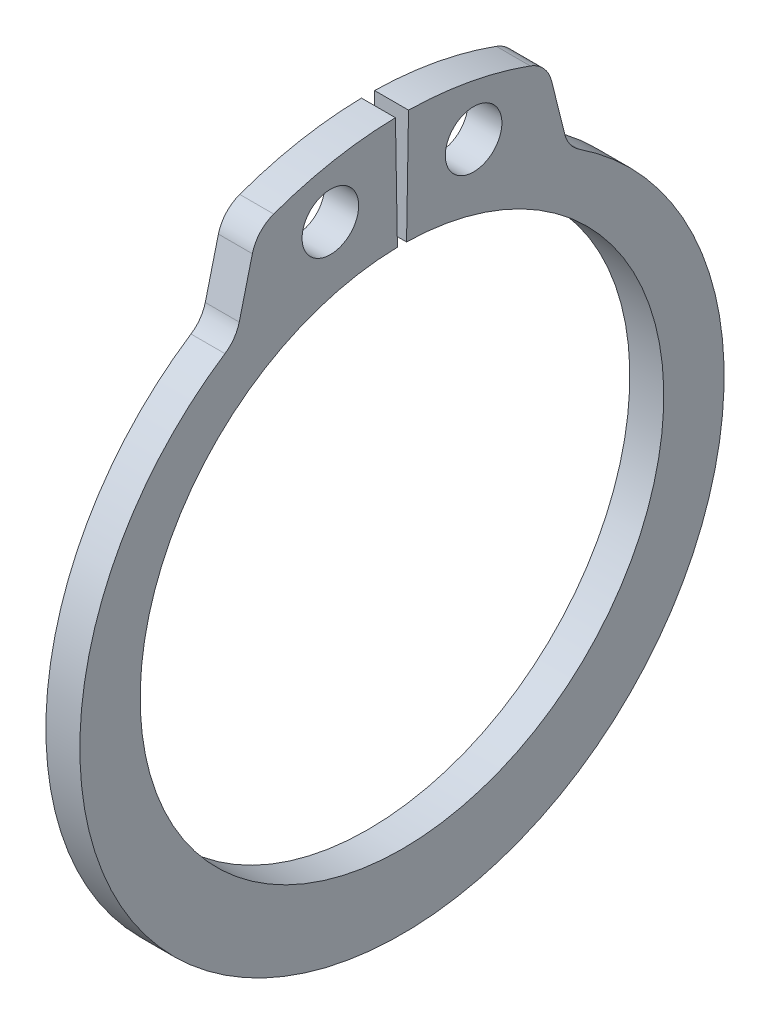
ISO-10303-21;
HEADER;
FILE_DESCRIPTION(('STEP AP214'),'2;1');
FILE_NAME('part.step','',(''),(''),'','','');
FILE_SCHEMA(('AUTOMOTIVE_DESIGN { 1 0 10303 214 1 1 1 1 }'));
ENDSEC;
DATA;
#1=APPLICATION_CONTEXT('core data for automotive mechanical design processes');
#2=APPLICATION_PROTOCOL_DEFINITION('international standard','automotive_design',2000,#1);
#3=PRODUCT_CONTEXT('',#1,'mechanical');
#4=PRODUCT('Part','Part','',(#3));
#5=PRODUCT_RELATED_PRODUCT_CATEGORY('part','',(#4));
#6=PRODUCT_DEFINITION_FORMATION('','',#4);
#7=PRODUCT_DEFINITION_CONTEXT('part definition',#1,'design');
#8=PRODUCT_DEFINITION('design','',#6,#7);
#9=PRODUCT_DEFINITION_SHAPE('','',#8);
#10=(LENGTH_UNIT() NAMED_UNIT(*) SI_UNIT(.MILLI.,.METRE.));
#11=(NAMED_UNIT(*) PLANE_ANGLE_UNIT() SI_UNIT($,.RADIAN.));
#12=(NAMED_UNIT(*) SI_UNIT($,.STERADIAN.) SOLID_ANGLE_UNIT());
#13=UNCERTAINTY_MEASURE_WITH_UNIT(LENGTH_MEASURE(1.E-05),#10,'distance_accuracy_value','');
#14=(GEOMETRIC_REPRESENTATION_CONTEXT(3) GLOBAL_UNCERTAINTY_ASSIGNED_CONTEXT((#13)) GLOBAL_UNIT_ASSIGNED_CONTEXT((#10,
#11,#12)) REPRESENTATION_CONTEXT('',''));
#15=CARTESIAN_POINT('',(0.,0.,0.));
#16=DIRECTION('',(0.,0.,1.));
#17=DIRECTION('',(1.,0.,0.));
#18=AXIS2_PLACEMENT_3D('',#15,#16,#17);
#19=CARTESIAN_POINT('',(0.6,0.,0.));
#20=DIRECTION('',(1.,0.,0.));
#21=DIRECTION('',(0.,0.,-1.));
#22=AXIS2_PLACEMENT_3D('',#19,#20,#21);
#23=PLANE('',#22);
#24=CARTESIAN_POINT('',(0.6,11.2075498339008,2.53014564968776));
#25=DIRECTION('',(1.,0.,0.));
#26=DIRECTION('',(0.,0.,-1.));
#27=AXIS2_PLACEMENT_3D('',#24,#25,#26);
#28=CIRCLE('',#27,1.);
#29=CARTESIAN_POINT('',(0.6,11.2075498339008,1.53014564968776));
#30=VERTEX_POINT('',#29);
#31=EDGE_CURVE('E218',#30,#30,#28,.T.);
#32=ORIENTED_EDGE('',*,*,#31,.F.);
#33=EDGE_LOOP('',(#32));
#34=FACE_BOUND('',#33,.T.);
#35=CARTESIAN_POINT('',(0.6,0.,0.));
#36=DIRECTION('',(1.,0.,0.));
#37=DIRECTION('',(0.,0.,-1.));
#38=AXIS2_PLACEMENT_3D('',#35,#36,#37);
#39=CIRCLE('',#38,13.25);
#40=CARTESIAN_POINT('',(0.6,13.2479819608222,0.231244385294007));
#41=VERTEX_POINT('',#40);
#42=CARTESIAN_POINT('',(0.6,12.4507767148435,4.53218040209241));
#43=VERTEX_POINT('',#42);
#44=EDGE_CURVE('E135',#41,#43,#39,.T.);
#45=ORIENTED_EDGE('',*,*,#44,.T.);
#46=CARTESIAN_POINT('',(0.6,11.3231592010464,4.12171878077083));
#47=DIRECTION('',(1.,0.,0.));
#48=DIRECTION('',(0.,0.,-1.));
#49=AXIS2_PLACEMENT_3D('',#46,#47,#48);
#50=CIRCLE('',#49,1.2);
#51=CARTESIAN_POINT('',(0.6,11.613465475766,5.28607365230203));
#52=VERTEX_POINT('',#51);
#53=EDGE_CURVE('E172',#43,#52,#50,.T.);
#54=ORIENTED_EDGE('',*,*,#53,.T.);
#55=DIRECTION('',(0.,-0.970295726275997,0.241921895599665));
#56=VECTOR('',#55,1.);
#57=CARTESIAN_POINT('',(0.6,12.2139395720065,5.13635864512732));
#58=LINE('',#57,#56);
#59=CARTESIAN_POINT('',(0.6,9.75327839740805,5.74987038146369));
#60=VERTEX_POINT('',#59);
#61=EDGE_CURVE('E210',#52,#60,#58,.T.);
#62=ORIENTED_EDGE('',*,*,#61,.T.);
#63=CARTESIAN_POINT('',(0.6,10.0435846721276,6.91422525299489));
#64=DIRECTION('',(1.,0.,0.));
#65=DIRECTION('',(0.,0.,-1.));
#66=AXIS2_PLACEMENT_3D('',#63,#64,#65);
#67=CIRCLE('',#66,1.2);
#68=CARTESIAN_POINT('',(0.6,9.04102340024933,6.25477783573576));
#69=VERTEX_POINT('',#68);
#70=EDGE_CURVE('E183',#60,#69,#67,.F.);
#71=ORIENTED_EDGE('',*,*,#70,.T.);
#72=CARTESIAN_POINT('',(0.6,-0.468147245038732,0.));
#73=DIRECTION('',(1.,0.,0.));
#74=DIRECTION('',(0.,0.,-1.));
#75=AXIS2_PLACEMENT_3D('',#72,#73,#74);
#76=CIRCLE('',#75,11.3818527549613);
#77=CARTESIAN_POINT('',(0.6,9.04102340024933,-6.25477783573577));
#78=VERTEX_POINT('',#77);
#79=EDGE_CURVE('E205',#69,#78,#76,.T.);
#80=ORIENTED_EDGE('',*,*,#79,.T.);
#81=CARTESIAN_POINT('',(0.6,10.0435846721276,-6.9142252529949));
#82=DIRECTION('',(1.,0.,0.));
#83=DIRECTION('',(0.,0.,-1.));
#84=AXIS2_PLACEMENT_3D('',#81,#82,#83);
#85=CIRCLE('',#84,1.2);
#86=CARTESIAN_POINT('',(0.6,9.75327839740804,-5.7498703814637));
#87=VERTEX_POINT('',#86);
#88=EDGE_CURVE('E11',#78,#87,#85,.F.);
#89=ORIENTED_EDGE('',*,*,#88,.T.);
#90=DIRECTION('',(0.,0.970295726275997,0.241921895599666));
#91=VECTOR('',#90,1.);
#92=CARTESIAN_POINT('',(0.6,12.2139395720065,-5.13635864512732));
#93=LINE('',#92,#91);
#94=CARTESIAN_POINT('',(0.6,11.613465475766,-5.28607365230203));
#95=VERTEX_POINT('',#94);
#96=EDGE_CURVE('E204',#87,#95,#93,.T.);
#97=ORIENTED_EDGE('',*,*,#96,.T.);
#98=CARTESIAN_POINT('',(0.6,11.3231592010464,-4.12171878077084));
#99=DIRECTION('',(1.,0.,0.));
#100=DIRECTION('',(0.,0.,-1.));
#101=AXIS2_PLACEMENT_3D('',#98,#99,#100);
#102=CIRCLE('',#101,1.2);
#103=CARTESIAN_POINT('',(0.6,12.4507767148435,-4.53218040209241));
#104=VERTEX_POINT('',#103);
#105=EDGE_CURVE('E50',#95,#104,#102,.T.);
#106=ORIENTED_EDGE('',*,*,#105,.T.);
#107=CARTESIAN_POINT('',(0.6,0.,0.));
#108=DIRECTION('',(1.,0.,0.));
#109=DIRECTION('',(0.,0.,1.));
#110=AXIS2_PLACEMENT_3D('',#107,#108,#109);
#111=CIRCLE('',#110,13.25);
#112=CARTESIAN_POINT('',(0.6,13.2479819608222,-0.231244385294012));
#113=VERTEX_POINT('',#112);
#114=EDGE_CURVE('E207',#104,#113,#111,.T.);
#115=ORIENTED_EDGE('',*,*,#114,.T.);
#116=DIRECTION('',(0.,-0.999847695156391,0.0174524064372846));
#117=VECTOR('',#116,1.);
#118=CARTESIAN_POINT('',(0.6,13.2479819608222,-0.231244385294011));
#119=LINE('',#118,#117);
#120=CARTESIAN_POINT('',(0.6,9.24859118019662,-0.161434759544873));
#121=VERTEX_POINT('',#120);
#122=EDGE_CURVE('E141',#113,#121,#119,.T.);
#123=ORIENTED_EDGE('',*,*,#122,.T.);
#124=CARTESIAN_POINT('',(0.6,0.,0.));
#125=DIRECTION('',(-1.,0.,0.));
#126=DIRECTION('',(0.,0.,-1.));
#127=AXIS2_PLACEMENT_3D('',#124,#125,#126);
#128=CIRCLE('',#127,9.25);
#129=CARTESIAN_POINT('',(0.6,9.24859118019662,0.161434759544873));
#130=VERTEX_POINT('',#129);
#131=EDGE_CURVE('E136',#121,#130,#128,.T.);
#132=ORIENTED_EDGE('',*,*,#131,.T.);
#133=DIRECTION('',(0.,0.999847695156391,0.0174524064372836));
#134=VECTOR('',#133,1.);
#135=CARTESIAN_POINT('',(0.6,9.24859118019662,0.161434759544873));
#136=LINE('',#135,#134);
#137=EDGE_CURVE('E125',#130,#41,#136,.T.);
#138=ORIENTED_EDGE('',*,*,#137,.T.);
#139=EDGE_LOOP('',(#45,#54,#62,#71,#80,#89,#97,#106,#115,#123,#132,#138));
#140=FACE_BOUND('',#139,.T.);
#141=CARTESIAN_POINT('',(0.6,11.2075498339008,-2.53014564968776));
#142=DIRECTION('',(1.,0.,0.));
#143=DIRECTION('',(0.,0.,-1.));
#144=AXIS2_PLACEMENT_3D('',#141,#142,#143);
#145=CIRCLE('',#144,1.);
#146=CARTESIAN_POINT('',(0.6,11.2075498339008,-3.53014564968776));
#147=VERTEX_POINT('',#146);
#148=EDGE_CURVE('E247',#147,#147,#145,.T.);
#149=ORIENTED_EDGE('',*,*,#148,.F.);
#150=EDGE_LOOP('',(#149));
#151=FACE_BOUND('',#150,.T.);
#152=ADVANCED_FACE('F35',(#34,#140,#151),#23,.T.);
#153=CARTESIAN_POINT('',(-0.6,0.,0.));
#154=DIRECTION('',(1.,0.,0.));
#155=DIRECTION('',(0.,0.,-1.));
#156=AXIS2_PLACEMENT_3D('',#153,#154,#155);
#157=PLANE('',#156);
#158=CARTESIAN_POINT('',(-0.6,11.2075498339008,2.53014564968776));
#159=DIRECTION('',(1.,0.,0.));
#160=DIRECTION('',(0.,0.,-1.));
#161=AXIS2_PLACEMENT_3D('',#158,#159,#160);
#162=CIRCLE('',#161,1.);
#163=CARTESIAN_POINT('',(-0.6,11.2075498339008,1.53014564968776));
#164=VERTEX_POINT('',#163);
#165=EDGE_CURVE('E244',#164,#164,#162,.T.);
#166=ORIENTED_EDGE('',*,*,#165,.T.);
#167=EDGE_LOOP('',(#166));
#168=FACE_BOUND('',#167,.T.);
#169=DIRECTION('',(0.,-0.970295726275997,0.241921895599665));
#170=VECTOR('',#169,1.);
#171=CARTESIAN_POINT('',(-0.6,12.2139395720065,5.13635864512732));
#172=LINE('',#171,#170);
#173=CARTESIAN_POINT('',(-0.6,11.613465475766,5.28607365230203));
#174=VERTEX_POINT('',#173);
#175=CARTESIAN_POINT('',(-0.6,9.75327839740805,5.74987038146369));
#176=VERTEX_POINT('',#175);
#177=EDGE_CURVE('E201',#174,#176,#172,.T.);
#178=ORIENTED_EDGE('',*,*,#177,.F.);
#179=CARTESIAN_POINT('',(-0.6,11.3231592010464,4.12171878077083));
#180=DIRECTION('',(1.,0.,0.));
#181=DIRECTION('',(0.,0.,-1.));
#182=AXIS2_PLACEMENT_3D('',#179,#180,#181);
#183=CIRCLE('',#182,1.2);
#184=CARTESIAN_POINT('',(-0.6,12.4507767148435,4.53218040209241));
#185=VERTEX_POINT('',#184);
#186=EDGE_CURVE('E167',#174,#185,#183,.F.);
#187=ORIENTED_EDGE('',*,*,#186,.T.);
#188=CARTESIAN_POINT('',(-0.6,0.,0.));
#189=DIRECTION('',(1.,0.,0.));
#190=DIRECTION('',(0.,0.,-1.));
#191=AXIS2_PLACEMENT_3D('',#188,#189,#190);
#192=CIRCLE('',#191,13.25);
#193=CARTESIAN_POINT('',(-0.6,13.2479819608222,0.231244385294007));
#194=VERTEX_POINT('',#193);
#195=EDGE_CURVE('E220',#194,#185,#192,.T.);
#196=ORIENTED_EDGE('',*,*,#195,.F.);
#197=DIRECTION('',(0.,0.999847695156391,0.0174524064372836));
#198=VECTOR('',#197,1.);
#199=CARTESIAN_POINT('',(-0.6,9.24859118019662,0.161434759544873));
#200=LINE('',#199,#198);
#201=CARTESIAN_POINT('',(-0.6,9.24859118019662,0.161434759544873));
#202=VERTEX_POINT('',#201);
#203=EDGE_CURVE('E217',#202,#194,#200,.T.);
#204=ORIENTED_EDGE('',*,*,#203,.F.);
#205=CARTESIAN_POINT('',(-0.6,0.,0.));
#206=DIRECTION('',(-1.,0.,0.));
#207=DIRECTION('',(0.,0.,-1.));
#208=AXIS2_PLACEMENT_3D('',#205,#206,#207);
#209=CIRCLE('',#208,9.25);
#210=CARTESIAN_POINT('',(-0.6,9.24859118019662,-0.161434759544873));
#211=VERTEX_POINT('',#210);
#212=EDGE_CURVE('E149',#211,#202,#209,.T.);
#213=ORIENTED_EDGE('',*,*,#212,.F.);
#214=DIRECTION('',(0.,-0.999847695156391,0.0174524064372846));
#215=VECTOR('',#214,1.);
#216=CARTESIAN_POINT('',(-0.6,13.2479819608222,-0.231244385294011));
#217=LINE('',#216,#215);
#218=CARTESIAN_POINT('',(-0.6,13.2479819608222,-0.231244385294012));
#219=VERTEX_POINT('',#218);
#220=EDGE_CURVE('E145',#219,#211,#217,.T.);
#221=ORIENTED_EDGE('',*,*,#220,.F.);
#222=CARTESIAN_POINT('',(-0.6,0.,0.));
#223=DIRECTION('',(1.,0.,0.));
#224=DIRECTION('',(0.,0.,1.));
#225=AXIS2_PLACEMENT_3D('',#222,#223,#224);
#226=CIRCLE('',#225,13.25);
#227=CARTESIAN_POINT('',(-0.6,12.4507767148435,-4.53218040209241));
#228=VERTEX_POINT('',#227);
#229=EDGE_CURVE('E226',#228,#219,#226,.T.);
#230=ORIENTED_EDGE('',*,*,#229,.F.);
#231=CARTESIAN_POINT('',(-0.6,11.3231592010464,-4.12171878077084));
#232=DIRECTION('',(1.,0.,0.));
#233=DIRECTION('',(0.,0.,-1.));
#234=AXIS2_PLACEMENT_3D('',#231,#232,#233);
#235=CIRCLE('',#234,1.2);
#236=CARTESIAN_POINT('',(-0.6,11.613465475766,-5.28607365230203));
#237=VERTEX_POINT('',#236);
#238=EDGE_CURVE('E165',#228,#237,#235,.F.);
#239=ORIENTED_EDGE('',*,*,#238,.T.);
#240=DIRECTION('',(0.,0.970295726275997,0.241921895599666));
#241=VECTOR('',#240,1.);
#242=CARTESIAN_POINT('',(-0.6,12.2139395720065,-5.13635864512732));
#243=LINE('',#242,#241);
#244=CARTESIAN_POINT('',(-0.6,9.75327839740804,-5.7498703814637));
#245=VERTEX_POINT('',#244);
#246=EDGE_CURVE('E192',#245,#237,#243,.T.);
#247=ORIENTED_EDGE('',*,*,#246,.F.);
#248=CARTESIAN_POINT('',(-0.6,10.0435846721276,-6.9142252529949));
#249=DIRECTION('',(1.,0.,0.));
#250=DIRECTION('',(0.,0.,-1.));
#251=AXIS2_PLACEMENT_3D('',#248,#249,#250);
#252=CIRCLE('',#251,1.2);
#253=CARTESIAN_POINT('',(-0.6,9.04102340024933,-6.25477783573577));
#254=VERTEX_POINT('',#253);
#255=EDGE_CURVE('E43',#245,#254,#252,.T.);
#256=ORIENTED_EDGE('',*,*,#255,.T.);
#257=CARTESIAN_POINT('',(-0.6,-0.468147245038732,0.));
#258=DIRECTION('',(1.,0.,0.));
#259=DIRECTION('',(0.,0.,-1.));
#260=AXIS2_PLACEMENT_3D('',#257,#258,#259);
#261=CIRCLE('',#260,11.3818527549613);
#262=CARTESIAN_POINT('',(-0.6,9.04102340024933,6.25477783573576));
#263=VERTEX_POINT('',#262);
#264=EDGE_CURVE('E191',#263,#254,#261,.T.);
#265=ORIENTED_EDGE('',*,*,#264,.F.);
#266=CARTESIAN_POINT('',(-0.6,10.0435846721276,6.91422525299489));
#267=DIRECTION('',(1.,0.,0.));
#268=DIRECTION('',(0.,0.,-1.));
#269=AXIS2_PLACEMENT_3D('',#266,#267,#268);
#270=CIRCLE('',#269,1.2);
#271=EDGE_CURVE('E181',#263,#176,#270,.T.);
#272=ORIENTED_EDGE('',*,*,#271,.T.);
#273=EDGE_LOOP('',(#178,#187,#196,#204,#213,#221,#230,#239,#247,#256,#265,#272));
#274=FACE_BOUND('',#273,.T.);
#275=CARTESIAN_POINT('',(-0.6,11.2075498339008,-2.53014564968776));
#276=DIRECTION('',(1.,0.,0.));
#277=DIRECTION('',(0.,0.,-1.));
#278=AXIS2_PLACEMENT_3D('',#275,#276,#277);
#279=CIRCLE('',#278,1.);
#280=CARTESIAN_POINT('',(-0.6,11.2075498339008,-3.53014564968776));
#281=VERTEX_POINT('',#280);
#282=EDGE_CURVE('E250',#281,#281,#279,.T.);
#283=ORIENTED_EDGE('',*,*,#282,.T.);
#284=EDGE_LOOP('',(#283));
#285=FACE_BOUND('',#284,.T.);
#286=ADVANCED_FACE('F189',(#168,#274,#285),#157,.F.);
#287=CARTESIAN_POINT('',(0.6,0.,0.));
#288=DIRECTION('',(-1.,0.,0.));
#289=DIRECTION('',(0.,0.,1.));
#290=AXIS2_PLACEMENT_3D('',#287,#288,#289);
#291=CYLINDRICAL_SURFACE('',#290,9.25);
#292=ORIENTED_EDGE('',*,*,#212,.T.);
#293=DIRECTION('',(-1.,0.,0.));
#294=VECTOR('',#293,1.);
#295=CARTESIAN_POINT('',(0.6,9.24859118019662,0.161434759544873));
#296=LINE('',#295,#294);
#297=EDGE_CURVE('E129',#130,#202,#296,.T.);
#298=ORIENTED_EDGE('',*,*,#297,.F.);
#299=ORIENTED_EDGE('',*,*,#131,.F.);
#300=DIRECTION('',(-1.,0.,0.));
#301=VECTOR('',#300,1.);
#302=CARTESIAN_POINT('',(0.6,9.24859118019662,-0.161434759544873));
#303=LINE('',#302,#301);
#304=EDGE_CURVE('E215',#121,#211,#303,.T.);
#305=ORIENTED_EDGE('',*,*,#304,.T.);
#306=EDGE_LOOP('',(#292,#298,#299,#305));
#307=FACE_BOUND('',#306,.T.);
#308=ADVANCED_FACE('F147',(#307),#291,.F.);
#309=CARTESIAN_POINT('',(0.6,9.24859118019662,0.161434759544873));
#310=DIRECTION('',(0.,-0.0174524064372835,0.999847695156391));
#311=DIRECTION('',(0.,-0.999847695156391,-0.0174524064372835));
#312=AXIS2_PLACEMENT_3D('',#309,#310,#311);
#313=PLANE('',#312);
#314=ORIENTED_EDGE('',*,*,#203,.T.);
#315=DIRECTION('',(-1.,0.,0.));
#316=VECTOR('',#315,1.);
#317=CARTESIAN_POINT('',(0.6,13.2479819608222,0.231244385294007));
#318=LINE('',#317,#316);
#319=EDGE_CURVE('E132',#41,#194,#318,.T.);
#320=ORIENTED_EDGE('',*,*,#319,.F.);
#321=ORIENTED_EDGE('',*,*,#137,.F.);
#322=ORIENTED_EDGE('',*,*,#297,.T.);
#323=EDGE_LOOP('',(#314,#320,#321,#322));
#324=FACE_BOUND('',#323,.T.);
#325=ADVANCED_FACE('F127',(#324),#313,.F.);
#326=CARTESIAN_POINT('',(0.6,0.,0.));
#327=DIRECTION('',(-1.,0.,0.));
#328=DIRECTION('',(0.,0.,1.));
#329=AXIS2_PLACEMENT_3D('',#326,#327,#328);
#330=CYLINDRICAL_SURFACE('',#329,13.25);
#331=ORIENTED_EDGE('',*,*,#195,.T.);
#332=DIRECTION('',(-1.,0.,0.));
#333=VECTOR('',#332,1.);
#334=CARTESIAN_POINT('',(0.6,12.4507767148435,4.53218040209241));
#335=LINE('',#334,#333);
#336=EDGE_CURVE('E169',#185,#43,#335,.F.);
#337=ORIENTED_EDGE('',*,*,#336,.T.);
#338=ORIENTED_EDGE('',*,*,#44,.F.);
#339=ORIENTED_EDGE('',*,*,#319,.T.);
#340=EDGE_LOOP('',(#331,#337,#338,#339));
#341=FACE_BOUND('',#340,.T.);
#342=ADVANCED_FACE('F238',(#341),#330,.T.);
#343=CARTESIAN_POINT('',(0.6,12.2139395720065,5.13635864512732));
#344=DIRECTION('',(0.,-0.241921895599665,-0.970295726275997));
#345=DIRECTION('',(0.,0.970295726275997,-0.241921895599665));
#346=AXIS2_PLACEMENT_3D('',#343,#344,#345);
#347=PLANE('',#346);
#348=ORIENTED_EDGE('',*,*,#177,.T.);
#349=DIRECTION('',(1.,0.,0.));
#350=VECTOR('',#349,1.);
#351=CARTESIAN_POINT('',(0.6,9.75327839740805,5.74987038146369));
#352=LINE('',#351,#350);
#353=EDGE_CURVE('E163',#176,#60,#352,.T.);
#354=ORIENTED_EDGE('',*,*,#353,.T.);
#355=ORIENTED_EDGE('',*,*,#61,.F.);
#356=DIRECTION('',(-1.,0.,0.));
#357=VECTOR('',#356,1.);
#358=CARTESIAN_POINT('',(0.6,11.613465475766,5.28607365230203));
#359=LINE('',#358,#357);
#360=EDGE_CURVE('E160',#52,#174,#359,.T.);
#361=ORIENTED_EDGE('',*,*,#360,.T.);
#362=EDGE_LOOP('',(#348,#354,#355,#361));
#363=FACE_BOUND('',#362,.T.);
#364=ADVANCED_FACE('F280',(#363),#347,.F.);
#365=CARTESIAN_POINT('',(0.6,-0.468147245038732,0.));
#366=DIRECTION('',(-1.,0.,0.));
#367=DIRECTION('',(0.,0.,1.));
#368=AXIS2_PLACEMENT_3D('',#365,#366,#367);
#369=CYLINDRICAL_SURFACE('',#368,11.3818527549613);
#370=ORIENTED_EDGE('',*,*,#79,.F.);
#371=DIRECTION('',(-1.,0.,0.));
#372=VECTOR('',#371,1.);
#373=CARTESIAN_POINT('',(0.6,9.04102340024933,6.25477783573576));
#374=LINE('',#373,#372);
#375=EDGE_CURVE('E152',#69,#263,#374,.T.);
#376=ORIENTED_EDGE('',*,*,#375,.T.);
#377=ORIENTED_EDGE('',*,*,#264,.T.);
#378=DIRECTION('',(-1.,0.,0.));
#379=VECTOR('',#378,1.);
#380=CARTESIAN_POINT('',(0.6,9.04102340024933,-6.25477783573577));
#381=LINE('',#380,#379);
#382=EDGE_CURVE('E150',#254,#78,#381,.F.);
#383=ORIENTED_EDGE('',*,*,#382,.T.);
#384=EDGE_LOOP('',(#370,#376,#377,#383));
#385=FACE_BOUND('',#384,.T.);
#386=ADVANCED_FACE('F198',(#385),#369,.T.);
#387=CARTESIAN_POINT('',(0.6,12.2139395720065,-5.13635864512732));
#388=DIRECTION('',(0.,-0.241921895599666,0.970295726275997));
#389=DIRECTION('',(0.,-0.970295726275997,-0.241921895599666));
#390=AXIS2_PLACEMENT_3D('',#387,#388,#389);
#391=PLANE('',#390);
#392=ORIENTED_EDGE('',*,*,#246,.T.);
#393=DIRECTION('',(-1.,0.,0.));
#394=VECTOR('',#393,1.);
#395=CARTESIAN_POINT('',(0.6,11.613465475766,-5.28607365230203));
#396=LINE('',#395,#394);
#397=EDGE_CURVE('E58',#237,#95,#396,.F.);
#398=ORIENTED_EDGE('',*,*,#397,.T.);
#399=ORIENTED_EDGE('',*,*,#96,.F.);
#400=DIRECTION('',(1.,0.,0.));
#401=VECTOR('',#400,1.);
#402=CARTESIAN_POINT('',(-0.6,9.75327839740804,-5.7498703814637));
#403=LINE('',#402,#401);
#404=EDGE_CURVE('E177',#87,#245,#403,.F.);
#405=ORIENTED_EDGE('',*,*,#404,.T.);
#406=EDGE_LOOP('',(#392,#398,#399,#405));
#407=FACE_BOUND('',#406,.T.);
#408=ADVANCED_FACE('F206',(#407),#391,.F.);
#409=CARTESIAN_POINT('',(0.6,0.,0.));
#410=DIRECTION('',(-1.,0.,0.));
#411=DIRECTION('',(0.,0.,1.));
#412=AXIS2_PLACEMENT_3D('',#409,#410,#411);
#413=CYLINDRICAL_SURFACE('',#412,13.25);
#414=ORIENTED_EDGE('',*,*,#114,.F.);
#415=DIRECTION('',(-1.,0.,0.));
#416=VECTOR('',#415,1.);
#417=CARTESIAN_POINT('',(0.6,12.4507767148435,-4.53218040209241));
#418=LINE('',#417,#416);
#419=EDGE_CURVE('E174',#104,#228,#418,.T.);
#420=ORIENTED_EDGE('',*,*,#419,.T.);
#421=ORIENTED_EDGE('',*,*,#229,.T.);
#422=DIRECTION('',(-1.,0.,0.));
#423=VECTOR('',#422,1.);
#424=CARTESIAN_POINT('',(0.6,13.2479819608222,-0.231244385294012));
#425=LINE('',#424,#423);
#426=EDGE_CURVE('E154',#113,#219,#425,.T.);
#427=ORIENTED_EDGE('',*,*,#426,.F.);
#428=EDGE_LOOP('',(#414,#420,#421,#427));
#429=FACE_BOUND('',#428,.T.);
#430=ADVANCED_FACE('F273',(#429),#413,.T.);
#431=CARTESIAN_POINT('',(0.6,13.2479819608222,-0.231244385294011));
#432=DIRECTION('',(0.,-0.0174524064372846,-0.999847695156391));
#433=DIRECTION('',(0.,0.999847695156391,-0.0174524064372846));
#434=AXIS2_PLACEMENT_3D('',#431,#432,#433);
#435=PLANE('',#434);
#436=ORIENTED_EDGE('',*,*,#220,.T.);
#437=ORIENTED_EDGE('',*,*,#304,.F.);
#438=ORIENTED_EDGE('',*,*,#122,.F.);
#439=ORIENTED_EDGE('',*,*,#426,.T.);
#440=EDGE_LOOP('',(#436,#437,#438,#439));
#441=FACE_BOUND('',#440,.T.);
#442=ADVANCED_FACE('F233',(#441),#435,.F.);
#443=CARTESIAN_POINT('',(0.6,11.2075498339008,2.53014564968776));
#444=DIRECTION('',(-1.,0.,0.));
#445=DIRECTION('',(0.,0.,1.));
#446=AXIS2_PLACEMENT_3D('',#443,#444,#445);
#447=CYLINDRICAL_SURFACE('',#446,1.);
#448=ORIENTED_EDGE('',*,*,#31,.T.);
#449=EDGE_LOOP('',(#448));
#450=FACE_BOUND('',#449,.T.);
#451=ORIENTED_EDGE('',*,*,#165,.F.);
#452=EDGE_LOOP('',(#451));
#453=FACE_BOUND('',#452,.T.);
#454=ADVANCED_FACE('F268',(#450,#453),#447,.F.);
#455=CARTESIAN_POINT('',(0.6,11.2075498339008,-2.53014564968776));
#456=DIRECTION('',(-1.,0.,0.));
#457=DIRECTION('',(0.,0.,1.));
#458=AXIS2_PLACEMENT_3D('',#455,#456,#457);
#459=CYLINDRICAL_SURFACE('',#458,1.);
#460=ORIENTED_EDGE('',*,*,#148,.T.);
#461=EDGE_LOOP('',(#460));
#462=FACE_BOUND('',#461,.T.);
#463=ORIENTED_EDGE('',*,*,#282,.F.);
#464=EDGE_LOOP('',(#463));
#465=FACE_BOUND('',#464,.T.);
#466=ADVANCED_FACE('F256',(#462,#465),#459,.F.);
#467=CARTESIAN_POINT('',(0.6,10.0435846721276,6.91422525299489));
#468=DIRECTION('',(-1.,0.,0.));
#469=DIRECTION('',(0.,0.,1.));
#470=AXIS2_PLACEMENT_3D('',#467,#468,#469);
#471=CYLINDRICAL_SURFACE('',#470,1.2);
#472=ORIENTED_EDGE('',*,*,#70,.F.);
#473=ORIENTED_EDGE('',*,*,#353,.F.);
#474=ORIENTED_EDGE('',*,*,#271,.F.);
#475=ORIENTED_EDGE('',*,*,#375,.F.);
#476=EDGE_LOOP('',(#472,#473,#474,#475));
#477=FACE_BOUND('',#476,.T.);
#478=ADVANCED_FACE('F290',(#477),#471,.F.);
#479=CARTESIAN_POINT('',(0.6,11.3231592010464,4.12171878077083));
#480=DIRECTION('',(-1.,0.,0.));
#481=DIRECTION('',(0.,0.,1.));
#482=AXIS2_PLACEMENT_3D('',#479,#480,#481);
#483=CYLINDRICAL_SURFACE('',#482,1.2);
#484=ORIENTED_EDGE('',*,*,#53,.F.);
#485=ORIENTED_EDGE('',*,*,#336,.F.);
#486=ORIENTED_EDGE('',*,*,#186,.F.);
#487=ORIENTED_EDGE('',*,*,#360,.F.);
#488=EDGE_LOOP('',(#484,#485,#486,#487));
#489=FACE_BOUND('',#488,.T.);
#490=ADVANCED_FACE('F293',(#489),#483,.T.);
#491=CARTESIAN_POINT('',(0.6,11.3231592010464,-4.12171878077084));
#492=DIRECTION('',(-1.,0.,0.));
#493=DIRECTION('',(0.,0.,1.));
#494=AXIS2_PLACEMENT_3D('',#491,#492,#493);
#495=CYLINDRICAL_SURFACE('',#494,1.2);
#496=ORIENTED_EDGE('',*,*,#105,.F.);
#497=ORIENTED_EDGE('',*,*,#397,.F.);
#498=ORIENTED_EDGE('',*,*,#238,.F.);
#499=ORIENTED_EDGE('',*,*,#419,.F.);
#500=EDGE_LOOP('',(#496,#497,#498,#499));
#501=FACE_BOUND('',#500,.T.);
#502=ADVANCED_FACE('F296',(#501),#495,.T.);
#503=CARTESIAN_POINT('',(0.6,10.0435846721276,-6.9142252529949));
#504=DIRECTION('',(-1.,0.,0.));
#505=DIRECTION('',(0.,0.,1.));
#506=AXIS2_PLACEMENT_3D('',#503,#504,#505);
#507=CYLINDRICAL_SURFACE('',#506,1.2);
#508=ORIENTED_EDGE('',*,*,#88,.F.);
#509=ORIENTED_EDGE('',*,*,#382,.F.);
#510=ORIENTED_EDGE('',*,*,#255,.F.);
#511=ORIENTED_EDGE('',*,*,#404,.F.);
#512=EDGE_LOOP('',(#508,#509,#510,#511));
#513=FACE_BOUND('',#512,.T.);
#514=ADVANCED_FACE('F37',(#513),#507,.F.);
#515=CLOSED_SHELL('',(#152,#286,#308,#325,#342,#364,#386,#408,#430,#442,#454,#466,#478,#490,
#502,#514));
#516=MANIFOLD_SOLID_BREP('B2',#515);
#517=ADVANCED_BREP_SHAPE_REPRESENTATION('',(#18,#516),#14);
#518=SHAPE_DEFINITION_REPRESENTATION(#9,#517);
ENDSEC;
END-ISO-10303-21;
